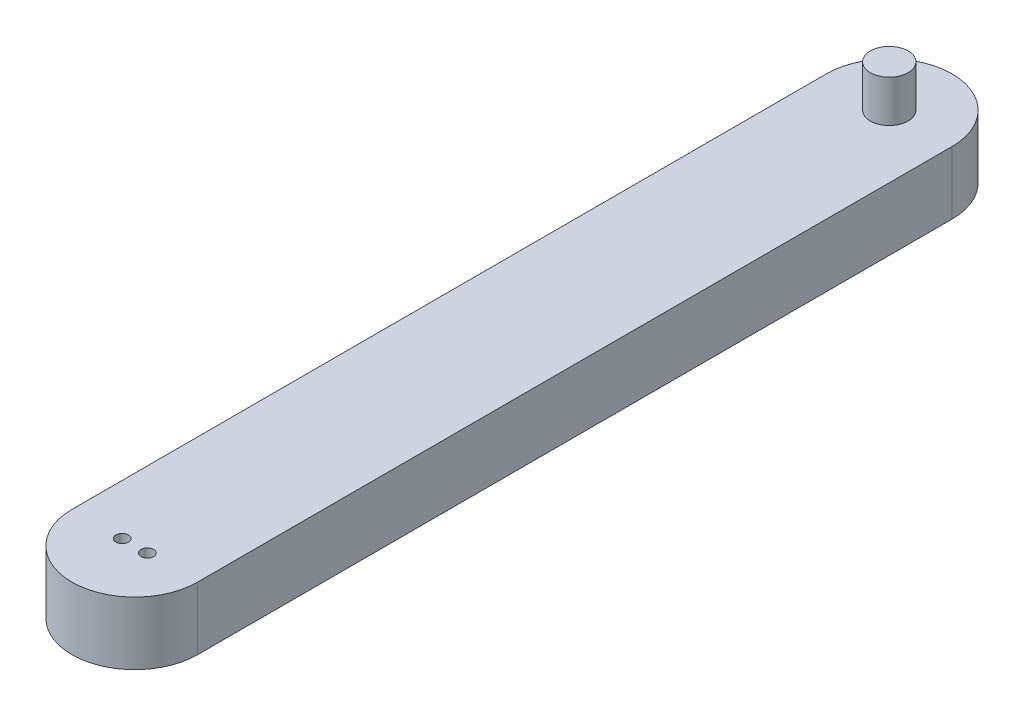
ISO-10303-21;
HEADER;
FILE_DESCRIPTION(('STEP AP214'),'2;1');
FILE_NAME('part.step','',(''),(''),'','','');
FILE_SCHEMA(('AUTOMOTIVE_DESIGN { 1 0 10303 214 1 1 1 1 }'));
ENDSEC;
DATA;
#1=APPLICATION_CONTEXT('core data for automotive mechanical design processes');
#2=APPLICATION_PROTOCOL_DEFINITION('international standard','automotive_design',2000,#1);
#3=PRODUCT_CONTEXT('',#1,'mechanical');
#4=PRODUCT('Part','Part','',(#3));
#5=PRODUCT_RELATED_PRODUCT_CATEGORY('part','',(#4));
#6=PRODUCT_DEFINITION_FORMATION('','',#4);
#7=PRODUCT_DEFINITION_CONTEXT('part definition',#1,'design');
#8=PRODUCT_DEFINITION('design','',#6,#7);
#9=PRODUCT_DEFINITION_SHAPE('','',#8);
#10=(LENGTH_UNIT() NAMED_UNIT(*) SI_UNIT(.MILLI.,.METRE.));
#11=(NAMED_UNIT(*) PLANE_ANGLE_UNIT() SI_UNIT($,.RADIAN.));
#12=(NAMED_UNIT(*) SI_UNIT($,.STERADIAN.) SOLID_ANGLE_UNIT());
#13=UNCERTAINTY_MEASURE_WITH_UNIT(LENGTH_MEASURE(1.E-05),#10,'distance_accuracy_value','');
#14=(GEOMETRIC_REPRESENTATION_CONTEXT(3) GLOBAL_UNCERTAINTY_ASSIGNED_CONTEXT((#13)) GLOBAL_UNIT_ASSIGNED_CONTEXT((#10,
#11,#12)) REPRESENTATION_CONTEXT('',''));
#15=CARTESIAN_POINT('',(0.,0.,0.));
#16=DIRECTION('',(0.,0.,1.));
#17=DIRECTION('',(1.,0.,0.));
#18=AXIS2_PLACEMENT_3D('',#15,#16,#17);
#19=CARTESIAN_POINT('',(4.75451263537906,7.5,-4.91877256317691));
#20=DIRECTION('',(0.,-1.,0.));
#21=DIRECTION('',(0.,0.,-1.));
#22=AXIS2_PLACEMENT_3D('',#19,#20,#21);
#23=CYLINDRICAL_SURFACE('',#22,0.75);
#24=CARTESIAN_POINT('',(4.75451263537906,7.5,-4.91877256317691));
#25=DIRECTION('',(0.,1.,0.));
#26=DIRECTION('',(0.,0.,1.));
#27=AXIS2_PLACEMENT_3D('',#24,#25,#26);
#28=CIRCLE('',#27,0.75);
#29=CARTESIAN_POINT('',(4.75451263537906,7.5,-4.16877256317691));
#30=VERTEX_POINT('',#29);
#31=EDGE_CURVE('E176',#30,#30,#28,.T.);
#32=ORIENTED_EDGE('',*,*,#31,.T.);
#33=EDGE_LOOP('',(#32));
#34=FACE_BOUND('',#33,.T.);
#35=CARTESIAN_POINT('',(4.75451263537906,5.,-4.91877256317691));
#36=DIRECTION('',(0.,-1.,0.));
#37=DIRECTION('',(0.,0.,-1.));
#38=AXIS2_PLACEMENT_3D('',#35,#36,#37);
#39=CIRCLE('',#38,0.75);
#40=CARTESIAN_POINT('',(4.75451263537906,5.,-5.66877256317691));
#41=VERTEX_POINT('',#40);
#42=EDGE_CURVE('E168',#41,#41,#39,.T.);
#43=ORIENTED_EDGE('',*,*,#42,.T.);
#44=EDGE_LOOP('',(#43));
#45=FACE_BOUND('',#44,.T.);
#46=ADVANCED_FACE('F39',(#34,#45),#23,.F.);
#47=CARTESIAN_POINT('',(7.75451263537906,7.5,-4.91877256317691));
#48=DIRECTION('',(0.,-1.,0.));
#49=DIRECTION('',(0.,0.,-1.));
#50=AXIS2_PLACEMENT_3D('',#47,#48,#49);
#51=CYLINDRICAL_SURFACE('',#50,0.75);
#52=CARTESIAN_POINT('',(7.75451263537906,7.5,-4.91877256317691));
#53=DIRECTION('',(0.,1.,0.));
#54=DIRECTION('',(0.,0.,1.));
#55=AXIS2_PLACEMENT_3D('',#52,#53,#54);
#56=CIRCLE('',#55,0.75);
#57=CARTESIAN_POINT('',(7.75451263537906,7.5,-4.16877256317691));
#58=VERTEX_POINT('',#57);
#59=EDGE_CURVE('E172',#58,#58,#56,.T.);
#60=ORIENTED_EDGE('',*,*,#59,.T.);
#61=EDGE_LOOP('',(#60));
#62=FACE_BOUND('',#61,.T.);
#63=CARTESIAN_POINT('',(7.75451263537906,5.,-4.91877256317691));
#64=DIRECTION('',(0.,-1.,0.));
#65=DIRECTION('',(0.,0.,-1.));
#66=AXIS2_PLACEMENT_3D('',#63,#64,#65);
#67=CIRCLE('',#66,0.75);
#68=CARTESIAN_POINT('',(7.75451263537906,5.,-5.66877256317691));
#69=VERTEX_POINT('',#68);
#70=EDGE_CURVE('E43',#69,#69,#67,.T.);
#71=ORIENTED_EDGE('',*,*,#70,.T.);
#72=EDGE_LOOP('',(#71));
#73=FACE_BOUND('',#72,.T.);
#74=ADVANCED_FACE('F234',(#62,#73),#51,.F.);
#75=CARTESIAN_POINT('',(6.25451263537905,7.5,-94.9187725631769));
#76=DIRECTION('',(0.,1.,0.));
#77=DIRECTION('',(0.,0.,1.));
#78=AXIS2_PLACEMENT_3D('',#75,#76,#77);
#79=PLANE('',#78);
#80=CARTESIAN_POINT('',(6.25451263537905,7.5,-94.9187725631769));
#81=DIRECTION('',(0.,1.,0.));
#82=DIRECTION('',(0.,0.,1.));
#83=AXIS2_PLACEMENT_3D('',#80,#81,#82);
#84=CIRCLE('',#83,2.25);
#85=CARTESIAN_POINT('',(6.25451263537905,7.5,-92.6687725631769));
#86=VERTEX_POINT('',#85);
#87=EDGE_CURVE('E144',#86,#86,#84,.T.);
#88=ORIENTED_EDGE('',*,*,#87,.F.);
#89=EDGE_LOOP('',(#88));
#90=FACE_BOUND('',#89,.T.);
#91=ORIENTED_EDGE('',*,*,#31,.F.);
#92=EDGE_LOOP('',(#91));
#93=FACE_BOUND('',#92,.T.);
#94=CARTESIAN_POINT('',(6.25451263537905,7.5,-94.9187725631769));
#95=DIRECTION('',(0.,1.,0.));
#96=DIRECTION('',(0.,0.,1.));
#97=AXIS2_PLACEMENT_3D('',#94,#95,#96);
#98=CIRCLE('',#97,7.5);
#99=CARTESIAN_POINT('',(13.7545126353791,7.5,-94.9187725631769));
#100=VERTEX_POINT('',#99);
#101=CARTESIAN_POINT('',(-1.24548736462095,7.5,-94.9187725631769));
#102=VERTEX_POINT('',#101);
#103=EDGE_CURVE('E181',#100,#102,#98,.T.);
#104=ORIENTED_EDGE('',*,*,#103,.T.);
#105=DIRECTION('',(0.,0.,1.));
#106=VECTOR('',#105,1.);
#107=CARTESIAN_POINT('',(-1.24548736462095,7.5,-94.9187725631769));
#108=LINE('',#107,#106);
#109=CARTESIAN_POINT('',(-1.24548736462094,7.5,-4.91877256317691));
#110=VERTEX_POINT('',#109);
#111=EDGE_CURVE('E93',#102,#110,#108,.T.);
#112=ORIENTED_EDGE('',*,*,#111,.T.);
#113=CARTESIAN_POINT('',(6.25451263537906,7.5,-4.91877256317691));
#114=DIRECTION('',(0.,1.,0.));
#115=DIRECTION('',(0.,0.,1.));
#116=AXIS2_PLACEMENT_3D('',#113,#114,#115);
#117=CIRCLE('',#116,7.5);
#118=CARTESIAN_POINT('',(13.7545126353791,7.5,-4.91877256317691));
#119=VERTEX_POINT('',#118);
#120=EDGE_CURVE('E186',#110,#119,#117,.T.);
#121=ORIENTED_EDGE('',*,*,#120,.T.);
#122=DIRECTION('',(0.,0.,-1.));
#123=VECTOR('',#122,1.);
#124=CARTESIAN_POINT('',(13.7545126353791,7.5,-94.9187725631769));
#125=LINE('',#124,#123);
#126=EDGE_CURVE('E65',#119,#100,#125,.T.);
#127=ORIENTED_EDGE('',*,*,#126,.T.);
#128=EDGE_LOOP('',(#104,#112,#121,#127));
#129=FACE_BOUND('',#128,.T.);
#130=ORIENTED_EDGE('',*,*,#59,.F.);
#131=EDGE_LOOP('',(#130));
#132=FACE_BOUND('',#131,.T.);
#133=ADVANCED_FACE('F240',(#90,#93,#129,#132),#79,.T.);
#134=CARTESIAN_POINT('',(6.25451263537905,0.,-94.9187725631769));
#135=DIRECTION('',(0.,1.,0.));
#136=DIRECTION('',(0.,0.,1.));
#137=AXIS2_PLACEMENT_3D('',#134,#135,#136);
#138=PLANE('',#137);
#139=DIRECTION('',(0.,0.,-1.));
#140=VECTOR('',#139,1.);
#141=CARTESIAN_POINT('',(1.25451263537906,0.,-4.91877256317691));
#142=LINE('',#141,#140);
#143=CARTESIAN_POINT('',(1.25451263537906,0.,-4.91877256317691));
#144=VERTEX_POINT('',#143);
#145=CARTESIAN_POINT('',(1.25451263537907,0.,-44.9187725631769));
#146=VERTEX_POINT('',#145);
#147=EDGE_CURVE('E153',#144,#146,#142,.T.);
#148=ORIENTED_EDGE('',*,*,#147,.F.);
#149=CARTESIAN_POINT('',(6.25451263537906,0.,-4.91877256317691));
#150=DIRECTION('',(0.,-1.,0.));
#151=DIRECTION('',(0.,0.,-1.));
#152=AXIS2_PLACEMENT_3D('',#149,#150,#151);
#153=CIRCLE('',#152,5.);
#154=CARTESIAN_POINT('',(11.2545126353791,0.,-4.91877256317691));
#155=VERTEX_POINT('',#154);
#156=EDGE_CURVE('E56',#155,#144,#153,.T.);
#157=ORIENTED_EDGE('',*,*,#156,.F.);
#158=DIRECTION('',(0.,0.,-1.));
#159=VECTOR('',#158,1.);
#160=CARTESIAN_POINT('',(11.2545126353791,0.,-4.91877256317691));
#161=LINE('',#160,#159);
#162=CARTESIAN_POINT('',(11.2545126353791,0.,-44.9187725631769));
#163=VERTEX_POINT('',#162);
#164=EDGE_CURVE('E137',#155,#163,#161,.T.);
#165=ORIENTED_EDGE('',*,*,#164,.T.);
#166=CARTESIAN_POINT('',(6.25451263537907,0.,-44.9187725631769));
#167=DIRECTION('',(0.,-1.,0.));
#168=DIRECTION('',(0.,0.,-1.));
#169=AXIS2_PLACEMENT_3D('',#166,#167,#168);
#170=CIRCLE('',#169,5.);
#171=EDGE_CURVE('E141',#146,#163,#170,.T.);
#172=ORIENTED_EDGE('',*,*,#171,.F.);
#173=EDGE_LOOP('',(#148,#157,#165,#172));
#174=FACE_BOUND('',#173,.T.);
#175=CARTESIAN_POINT('',(6.25451263537905,0.,-94.9187725631769));
#176=DIRECTION('',(0.,1.,0.));
#177=DIRECTION('',(0.,0.,1.));
#178=AXIS2_PLACEMENT_3D('',#175,#176,#177);
#179=CIRCLE('',#178,7.5);
#180=CARTESIAN_POINT('',(13.7545126353791,0.,-94.9187725631769));
#181=VERTEX_POINT('',#180);
#182=CARTESIAN_POINT('',(-1.24548736462095,0.,-94.9187725631769));
#183=VERTEX_POINT('',#182);
#184=EDGE_CURVE('E180',#181,#183,#179,.T.);
#185=ORIENTED_EDGE('',*,*,#184,.F.);
#186=DIRECTION('',(0.,0.,-1.));
#187=VECTOR('',#186,1.);
#188=CARTESIAN_POINT('',(13.7545126353791,0.,-94.9187725631769));
#189=LINE('',#188,#187);
#190=CARTESIAN_POINT('',(13.7545126353791,0.,-4.91877256317691));
#191=VERTEX_POINT('',#190);
#192=EDGE_CURVE('E86',#191,#181,#189,.T.);
#193=ORIENTED_EDGE('',*,*,#192,.F.);
#194=CARTESIAN_POINT('',(6.25451263537906,0.,-4.91877256317691));
#195=DIRECTION('',(0.,1.,0.));
#196=DIRECTION('',(0.,0.,1.));
#197=AXIS2_PLACEMENT_3D('',#194,#195,#196);
#198=CIRCLE('',#197,7.5);
#199=CARTESIAN_POINT('',(-1.24548736462094,0.,-4.91877256317691));
#200=VERTEX_POINT('',#199);
#201=EDGE_CURVE('E198',#200,#191,#198,.T.);
#202=ORIENTED_EDGE('',*,*,#201,.F.);
#203=DIRECTION('',(0.,0.,1.));
#204=VECTOR('',#203,1.);
#205=CARTESIAN_POINT('',(-1.24548736462095,0.,-94.9187725631769));
#206=LINE('',#205,#204);
#207=EDGE_CURVE('E195',#183,#200,#206,.T.);
#208=ORIENTED_EDGE('',*,*,#207,.F.);
#209=EDGE_LOOP('',(#185,#193,#202,#208));
#210=FACE_BOUND('',#209,.T.);
#211=ADVANCED_FACE('F217',(#174,#210),#138,.F.);
#212=CARTESIAN_POINT('',(6.25451263537905,7.5,-94.9187725631769));
#213=DIRECTION('',(0.,-1.,0.));
#214=DIRECTION('',(0.,0.,-1.));
#215=AXIS2_PLACEMENT_3D('',#212,#213,#214);
#216=CYLINDRICAL_SURFACE('',#215,7.5);
#217=ORIENTED_EDGE('',*,*,#184,.T.);
#218=DIRECTION('',(0.,-1.,0.));
#219=VECTOR('',#218,1.);
#220=CARTESIAN_POINT('',(-1.24548736462095,7.5,-94.9187725631769));
#221=LINE('',#220,#219);
#222=EDGE_CURVE('E11',#102,#183,#221,.T.);
#223=ORIENTED_EDGE('',*,*,#222,.F.);
#224=ORIENTED_EDGE('',*,*,#103,.F.);
#225=DIRECTION('',(0.,-1.,0.));
#226=VECTOR('',#225,1.);
#227=CARTESIAN_POINT('',(13.7545126353791,7.5,-94.9187725631769));
#228=LINE('',#227,#226);
#229=EDGE_CURVE('E191',#100,#181,#228,.T.);
#230=ORIENTED_EDGE('',*,*,#229,.T.);
#231=EDGE_LOOP('',(#217,#223,#224,#230));
#232=FACE_BOUND('',#231,.T.);
#233=ADVANCED_FACE('F41',(#232),#216,.T.);
#234=CARTESIAN_POINT('',(-1.24548736462095,7.5,-94.9187725631769));
#235=DIRECTION('',(1.,0.,0.));
#236=DIRECTION('',(0.,0.,-1.));
#237=AXIS2_PLACEMENT_3D('',#234,#235,#236);
#238=PLANE('',#237);
#239=ORIENTED_EDGE('',*,*,#207,.T.);
#240=DIRECTION('',(0.,-1.,0.));
#241=VECTOR('',#240,1.);
#242=CARTESIAN_POINT('',(-1.24548736462094,7.5,-4.91877256317691));
#243=LINE('',#242,#241);
#244=EDGE_CURVE('E49',#110,#200,#243,.T.);
#245=ORIENTED_EDGE('',*,*,#244,.F.);
#246=ORIENTED_EDGE('',*,*,#111,.F.);
#247=ORIENTED_EDGE('',*,*,#222,.T.);
#248=EDGE_LOOP('',(#239,#245,#246,#247));
#249=FACE_BOUND('',#248,.T.);
#250=ADVANCED_FACE('F230',(#249),#238,.F.);
#251=CARTESIAN_POINT('',(6.25451263537906,7.5,-4.91877256317691));
#252=DIRECTION('',(0.,-1.,0.));
#253=DIRECTION('',(0.,0.,-1.));
#254=AXIS2_PLACEMENT_3D('',#251,#252,#253);
#255=CYLINDRICAL_SURFACE('',#254,7.5);
#256=ORIENTED_EDGE('',*,*,#201,.T.);
#257=DIRECTION('',(0.,-1.,0.));
#258=VECTOR('',#257,1.);
#259=CARTESIAN_POINT('',(13.7545126353791,7.5,-4.91877256317691));
#260=LINE('',#259,#258);
#261=EDGE_CURVE('E205',#119,#191,#260,.T.);
#262=ORIENTED_EDGE('',*,*,#261,.F.);
#263=ORIENTED_EDGE('',*,*,#120,.F.);
#264=ORIENTED_EDGE('',*,*,#244,.T.);
#265=EDGE_LOOP('',(#256,#262,#263,#264));
#266=FACE_BOUND('',#265,.T.);
#267=ADVANCED_FACE('F213',(#266),#255,.T.);
#268=CARTESIAN_POINT('',(13.7545126353791,7.5,-94.9187725631769));
#269=DIRECTION('',(-1.,0.,0.));
#270=DIRECTION('',(0.,0.,1.));
#271=AXIS2_PLACEMENT_3D('',#268,#269,#270);
#272=PLANE('',#271);
#273=ORIENTED_EDGE('',*,*,#192,.T.);
#274=ORIENTED_EDGE('',*,*,#229,.F.);
#275=ORIENTED_EDGE('',*,*,#126,.F.);
#276=ORIENTED_EDGE('',*,*,#261,.T.);
#277=EDGE_LOOP('',(#273,#274,#275,#276));
#278=FACE_BOUND('',#277,.T.);
#279=ADVANCED_FACE('F221',(#278),#272,.F.);
#280=CARTESIAN_POINT('',(6.25451263537906,5.,-4.91877256317691));
#281=DIRECTION('',(0.,-1.,0.));
#282=DIRECTION('',(0.,0.,-1.));
#283=AXIS2_PLACEMENT_3D('',#280,#281,#282);
#284=CYLINDRICAL_SURFACE('',#283,5.);
#285=ORIENTED_EDGE('',*,*,#156,.T.);
#286=DIRECTION('',(0.,-1.,0.));
#287=VECTOR('',#286,1.);
#288=CARTESIAN_POINT('',(1.25451263537906,5.,-4.91877256317691));
#289=LINE('',#288,#287);
#290=CARTESIAN_POINT('',(1.25451263537906,5.,-4.91877256317691));
#291=VERTEX_POINT('',#290);
#292=EDGE_CURVE('E113',#291,#144,#289,.T.);
#293=ORIENTED_EDGE('',*,*,#292,.F.);
#294=CARTESIAN_POINT('',(6.25451263537906,5.,-4.91877256317691));
#295=DIRECTION('',(0.,-1.,0.));
#296=DIRECTION('',(0.,0.,-1.));
#297=AXIS2_PLACEMENT_3D('',#294,#295,#296);
#298=CIRCLE('',#297,5.);
#299=CARTESIAN_POINT('',(11.2545126353791,5.,-4.91877256317691));
#300=VERTEX_POINT('',#299);
#301=EDGE_CURVE('E117',#300,#291,#298,.T.);
#302=ORIENTED_EDGE('',*,*,#301,.F.);
#303=DIRECTION('',(0.,-1.,0.));
#304=VECTOR('',#303,1.);
#305=CARTESIAN_POINT('',(11.2545126353791,5.,-4.91877256317691));
#306=LINE('',#305,#304);
#307=EDGE_CURVE('E160',#300,#155,#306,.T.);
#308=ORIENTED_EDGE('',*,*,#307,.T.);
#309=EDGE_LOOP('',(#285,#293,#302,#308));
#310=FACE_BOUND('',#309,.T.);
#311=ADVANCED_FACE('F115',(#310),#284,.F.);
#312=CARTESIAN_POINT('',(11.2545126353791,5.,-4.91877256317691));
#313=DIRECTION('',(-1.,0.,0.));
#314=DIRECTION('',(0.,0.,1.));
#315=AXIS2_PLACEMENT_3D('',#312,#313,#314);
#316=PLANE('',#315);
#317=ORIENTED_EDGE('',*,*,#164,.F.);
#318=ORIENTED_EDGE('',*,*,#307,.F.);
#319=DIRECTION('',(0.,0.,-1.));
#320=VECTOR('',#319,1.);
#321=CARTESIAN_POINT('',(11.2545126353791,5.,-4.91877256317691));
#322=LINE('',#321,#320);
#323=CARTESIAN_POINT('',(11.2545126353791,5.,-44.9187725631769));
#324=VERTEX_POINT('',#323);
#325=EDGE_CURVE('E123',#300,#324,#322,.T.);
#326=ORIENTED_EDGE('',*,*,#325,.T.);
#327=DIRECTION('',(0.,-1.,0.));
#328=VECTOR('',#327,1.);
#329=CARTESIAN_POINT('',(11.2545126353791,5.,-44.9187725631769));
#330=LINE('',#329,#328);
#331=EDGE_CURVE('E163',#324,#163,#330,.T.);
#332=ORIENTED_EDGE('',*,*,#331,.T.);
#333=EDGE_LOOP('',(#317,#318,#326,#332));
#334=FACE_BOUND('',#333,.T.);
#335=ADVANCED_FACE('F228',(#334),#316,.T.);
#336=CARTESIAN_POINT('',(6.25451263537907,5.,-44.9187725631769));
#337=DIRECTION('',(0.,-1.,0.));
#338=DIRECTION('',(0.,0.,-1.));
#339=AXIS2_PLACEMENT_3D('',#336,#337,#338);
#340=CYLINDRICAL_SURFACE('',#339,5.);
#341=ORIENTED_EDGE('',*,*,#171,.T.);
#342=ORIENTED_EDGE('',*,*,#331,.F.);
#343=CARTESIAN_POINT('',(6.25451263537907,5.,-44.9187725631769));
#344=DIRECTION('',(0.,-1.,0.));
#345=DIRECTION('',(0.,0.,-1.));
#346=AXIS2_PLACEMENT_3D('',#343,#344,#345);
#347=CIRCLE('',#346,5.);
#348=CARTESIAN_POINT('',(1.25451263537907,5.,-44.9187725631769));
#349=VERTEX_POINT('',#348);
#350=EDGE_CURVE('E132',#349,#324,#347,.T.);
#351=ORIENTED_EDGE('',*,*,#350,.F.);
#352=DIRECTION('',(0.,-1.,0.));
#353=VECTOR('',#352,1.);
#354=CARTESIAN_POINT('',(1.25451263537907,5.,-44.9187725631769));
#355=LINE('',#354,#353);
#356=EDGE_CURVE('E122',#349,#146,#355,.T.);
#357=ORIENTED_EDGE('',*,*,#356,.T.);
#358=EDGE_LOOP('',(#341,#342,#351,#357));
#359=FACE_BOUND('',#358,.T.);
#360=ADVANCED_FACE('F256',(#359),#340,.F.);
#361=CARTESIAN_POINT('',(1.25451263537906,5.,-4.91877256317691));
#362=DIRECTION('',(-1.,0.,0.));
#363=DIRECTION('',(0.,0.,1.));
#364=AXIS2_PLACEMENT_3D('',#361,#362,#363);
#365=PLANE('',#364);
#366=ORIENTED_EDGE('',*,*,#147,.T.);
#367=ORIENTED_EDGE('',*,*,#356,.F.);
#368=DIRECTION('',(0.,0.,-1.));
#369=VECTOR('',#368,1.);
#370=CARTESIAN_POINT('',(1.25451263537906,5.,-4.91877256317691));
#371=LINE('',#370,#369);
#372=EDGE_CURVE('E126',#291,#349,#371,.T.);
#373=ORIENTED_EDGE('',*,*,#372,.F.);
#374=ORIENTED_EDGE('',*,*,#292,.T.);
#375=EDGE_LOOP('',(#366,#367,#373,#374));
#376=FACE_BOUND('',#375,.T.);
#377=ADVANCED_FACE('F127',(#376),#365,.F.);
#378=CARTESIAN_POINT('',(6.25451263537906,5.,-4.91877256317691));
#379=DIRECTION('',(0.,-1.,0.));
#380=DIRECTION('',(0.,0.,-1.));
#381=AXIS2_PLACEMENT_3D('',#378,#379,#380);
#382=PLANE('',#381);
#383=ORIENTED_EDGE('',*,*,#42,.F.);
#384=EDGE_LOOP('',(#383));
#385=FACE_BOUND('',#384,.T.);
#386=ORIENTED_EDGE('',*,*,#70,.F.);
#387=EDGE_LOOP('',(#386));
#388=FACE_BOUND('',#387,.T.);
#389=ORIENTED_EDGE('',*,*,#301,.T.);
#390=ORIENTED_EDGE('',*,*,#372,.T.);
#391=ORIENTED_EDGE('',*,*,#350,.T.);
#392=ORIENTED_EDGE('',*,*,#325,.F.);
#393=EDGE_LOOP('',(#389,#390,#391,#392));
#394=FACE_BOUND('',#393,.T.);
#395=ADVANCED_FACE('F135',(#385,#388,#394),#382,.T.);
#396=CARTESIAN_POINT('',(6.25451263537905,12.5,-94.9187725631769));
#397=DIRECTION('',(0.,-1.,0.));
#398=DIRECTION('',(0.,0.,-1.));
#399=AXIS2_PLACEMENT_3D('',#396,#397,#398);
#400=CYLINDRICAL_SURFACE('',#399,2.25);
#401=CARTESIAN_POINT('',(6.25451263537905,12.5,-94.9187725631769));
#402=DIRECTION('',(0.,1.,0.));
#403=DIRECTION('',(0.,0.,1.));
#404=AXIS2_PLACEMENT_3D('',#401,#402,#403);
#405=CIRCLE('',#404,2.25);
#406=CARTESIAN_POINT('',(6.25451263537905,12.5,-92.6687725631769));
#407=VERTEX_POINT('',#406);
#408=EDGE_CURVE('E154',#407,#407,#405,.T.);
#409=ORIENTED_EDGE('',*,*,#408,.F.);
#410=EDGE_LOOP('',(#409));
#411=FACE_BOUND('',#410,.T.);
#412=ORIENTED_EDGE('',*,*,#87,.T.);
#413=EDGE_LOOP('',(#412));
#414=FACE_BOUND('',#413,.T.);
#415=ADVANCED_FACE('F271',(#411,#414),#400,.T.);
#416=CARTESIAN_POINT('',(6.25451263537905,12.5,-94.9187725631769));
#417=DIRECTION('',(0.,1.,0.));
#418=DIRECTION('',(0.,0.,1.));
#419=AXIS2_PLACEMENT_3D('',#416,#417,#418);
#420=PLANE('',#419);
#421=ORIENTED_EDGE('',*,*,#408,.T.);
#422=EDGE_LOOP('',(#421));
#423=FACE_BOUND('',#422,.T.);
#424=ADVANCED_FACE('F276',(#423),#420,.T.);
#425=CLOSED_SHELL('',(#46,#74,#133,#211,#233,#250,#267,#279,#311,#335,#360,#377,#395,#415,#424));
#426=MANIFOLD_SOLID_BREP('B2',#425);
#427=ADVANCED_BREP_SHAPE_REPRESENTATION('',(#18,#426),#14);
#428=SHAPE_DEFINITION_REPRESENTATION(#9,#427);
ENDSEC;
END-ISO-10303-21;
